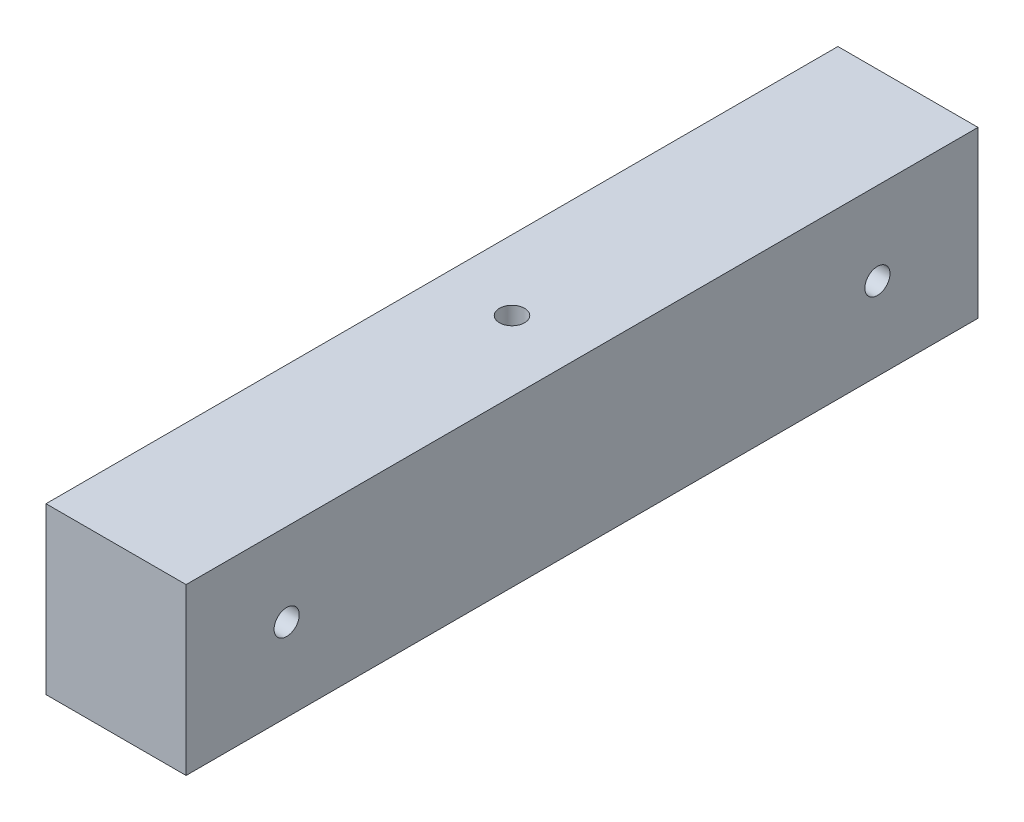
ISO-10303-21;
HEADER;
FILE_DESCRIPTION(('STEP AP214'),'2;1');
FILE_NAME('part.step','',(''),(''),'','','');
FILE_SCHEMA(('AUTOMOTIVE_DESIGN { 1 0 10303 214 1 1 1 1 }'));
ENDSEC;
DATA;
#1=APPLICATION_CONTEXT('core data for automotive mechanical design processes');
#2=APPLICATION_PROTOCOL_DEFINITION('international standard','automotive_design',2000,#1);
#3=PRODUCT_CONTEXT('',#1,'mechanical');
#4=PRODUCT('Part','Part','',(#3));
#5=PRODUCT_RELATED_PRODUCT_CATEGORY('part','',(#4));
#6=PRODUCT_DEFINITION_FORMATION('','',#4);
#7=PRODUCT_DEFINITION_CONTEXT('part definition',#1,'design');
#8=PRODUCT_DEFINITION('design','',#6,#7);
#9=PRODUCT_DEFINITION_SHAPE('','',#8);
#10=(LENGTH_UNIT() NAMED_UNIT(*) SI_UNIT(.MILLI.,.METRE.));
#11=(NAMED_UNIT(*) PLANE_ANGLE_UNIT() SI_UNIT($,.RADIAN.));
#12=(NAMED_UNIT(*) SI_UNIT($,.STERADIAN.) SOLID_ANGLE_UNIT());
#13=UNCERTAINTY_MEASURE_WITH_UNIT(LENGTH_MEASURE(1.E-05),#10,'distance_accuracy_value','');
#14=(GEOMETRIC_REPRESENTATION_CONTEXT(3) GLOBAL_UNCERTAINTY_ASSIGNED_CONTEXT((#13)) GLOBAL_UNIT_ASSIGNED_CONTEXT((#10,
#11,#12)) REPRESENTATION_CONTEXT('',''));
#15=CARTESIAN_POINT('',(0.,0.,0.));
#16=DIRECTION('',(0.,0.,1.));
#17=DIRECTION('',(1.,0.,0.));
#18=AXIS2_PLACEMENT_3D('',#15,#16,#17);
#19=CARTESIAN_POINT('',(0.,0.,100.));
#20=DIRECTION('',(1.,0.,0.));
#21=DIRECTION('',(0.,1.,0.));
#22=AXIS2_PLACEMENT_3D('',#19,#20,#21);
#23=PLANE('',#22);
#24=CARTESIAN_POINT('',(0.,10.44,87.3));
#25=DIRECTION('',(1.,0.,0.));
#26=DIRECTION('',(0.,1.,0.));
#27=AXIS2_PLACEMENT_3D('',#24,#25,#26);
#28=CIRCLE('',#27,1.5875);
#29=CARTESIAN_POINT('',(0.,12.0275,87.3));
#30=VERTEX_POINT('',#29);
#31=EDGE_CURVE('E114',#30,#30,#28,.T.);
#32=ORIENTED_EDGE('',*,*,#31,.T.);
#33=EDGE_LOOP('',(#32));
#34=FACE_BOUND('',#33,.T.);
#35=CARTESIAN_POINT('',(0.,10.44,12.7));
#36=DIRECTION('',(1.,0.,0.));
#37=DIRECTION('',(0.,1.,0.));
#38=AXIS2_PLACEMENT_3D('',#35,#36,#37);
#39=CIRCLE('',#38,1.5875);
#40=CARTESIAN_POINT('',(0.,12.0275,12.7));
#41=VERTEX_POINT('',#40);
#42=EDGE_CURVE('E117',#41,#41,#39,.T.);
#43=ORIENTED_EDGE('',*,*,#42,.T.);
#44=EDGE_LOOP('',(#43));
#45=FACE_BOUND('',#44,.T.);
#46=DIRECTION('',(0.,-1.,0.));
#47=VECTOR('',#46,1.);
#48=CARTESIAN_POINT('',(0.,0.,0.));
#49=LINE('',#48,#47);
#50=CARTESIAN_POINT('',(0.,20.88,0.));
#51=VERTEX_POINT('',#50);
#52=CARTESIAN_POINT('',(0.,0.,0.));
#53=VERTEX_POINT('',#52);
#54=EDGE_CURVE('E95',#51,#53,#49,.T.);
#55=ORIENTED_EDGE('',*,*,#54,.T.);
#56=DIRECTION('',(0.,0.,-1.));
#57=VECTOR('',#56,1.);
#58=CARTESIAN_POINT('',(0.,0.,100.));
#59=LINE('',#58,#57);
#60=CARTESIAN_POINT('',(0.,0.,100.));
#61=VERTEX_POINT('',#60);
#62=EDGE_CURVE('E11',#61,#53,#59,.T.);
#63=ORIENTED_EDGE('',*,*,#62,.F.);
#64=DIRECTION('',(0.,-1.,0.));
#65=VECTOR('',#64,1.);
#66=CARTESIAN_POINT('',(0.,0.,100.));
#67=LINE('',#66,#65);
#68=CARTESIAN_POINT('',(0.,20.88,100.));
#69=VERTEX_POINT('',#68);
#70=EDGE_CURVE('E83',#69,#61,#67,.T.);
#71=ORIENTED_EDGE('',*,*,#70,.F.);
#72=DIRECTION('',(0.,0.,-1.));
#73=VECTOR('',#72,1.);
#74=CARTESIAN_POINT('',(0.,20.88,100.));
#75=LINE('',#74,#73);
#76=EDGE_CURVE('E91',#69,#51,#75,.T.);
#77=ORIENTED_EDGE('',*,*,#76,.T.);
#78=EDGE_LOOP('',(#55,#63,#71,#77));
#79=FACE_BOUND('',#78,.T.);
#80=ADVANCED_FACE('F32',(#34,#45,#79),#23,.F.);
#81=CARTESIAN_POINT('',(0.,0.,100.));
#82=DIRECTION('',(0.,1.,0.));
#83=DIRECTION('',(0.,0.,1.));
#84=AXIS2_PLACEMENT_3D('',#81,#82,#83);
#85=PLANE('',#84);
#86=CARTESIAN_POINT('',(8.845,0.,50.));
#87=DIRECTION('',(0.,1.,0.));
#88=DIRECTION('',(0.,0.,1.));
#89=AXIS2_PLACEMENT_3D('',#86,#87,#88);
#90=CIRCLE('',#89,1.5875);
#91=CARTESIAN_POINT('',(8.845,0.,51.5875));
#92=VERTEX_POINT('',#91);
#93=EDGE_CURVE('E98',#92,#92,#90,.T.);
#94=ORIENTED_EDGE('',*,*,#93,.T.);
#95=EDGE_LOOP('',(#94));
#96=FACE_BOUND('',#95,.T.);
#97=DIRECTION('',(1.,0.,0.));
#98=VECTOR('',#97,1.);
#99=CARTESIAN_POINT('',(0.,0.,0.));
#100=LINE('',#99,#98);
#101=CARTESIAN_POINT('',(17.69,0.,0.));
#102=VERTEX_POINT('',#101);
#103=EDGE_CURVE('E87',#53,#102,#100,.T.);
#104=ORIENTED_EDGE('',*,*,#103,.T.);
#105=DIRECTION('',(0.,0.,-1.));
#106=VECTOR('',#105,1.);
#107=CARTESIAN_POINT('',(17.69,0.,100.));
#108=LINE('',#107,#106);
#109=CARTESIAN_POINT('',(17.69,0.,100.));
#110=VERTEX_POINT('',#109);
#111=EDGE_CURVE('E40',#110,#102,#108,.T.);
#112=ORIENTED_EDGE('',*,*,#111,.F.);
#113=DIRECTION('',(1.,0.,0.));
#114=VECTOR('',#113,1.);
#115=CARTESIAN_POINT('',(0.,0.,100.));
#116=LINE('',#115,#114);
#117=EDGE_CURVE('E78',#61,#110,#116,.T.);
#118=ORIENTED_EDGE('',*,*,#117,.F.);
#119=ORIENTED_EDGE('',*,*,#62,.T.);
#120=EDGE_LOOP('',(#104,#112,#118,#119));
#121=FACE_BOUND('',#120,.T.);
#122=ADVANCED_FACE('F86',(#96,#121),#85,.F.);
#123=CARTESIAN_POINT('',(17.69,0.,100.));
#124=DIRECTION('',(-1.,0.,0.));
#125=DIRECTION('',(0.,-1.,0.));
#126=AXIS2_PLACEMENT_3D('',#123,#124,#125);
#127=PLANE('',#126);
#128=CARTESIAN_POINT('',(17.69,10.44,87.3));
#129=DIRECTION('',(1.,0.,0.));
#130=DIRECTION('',(0.,1.,0.));
#131=AXIS2_PLACEMENT_3D('',#128,#129,#130);
#132=CIRCLE('',#131,1.5875);
#133=CARTESIAN_POINT('',(17.69,12.0275,87.3));
#134=VERTEX_POINT('',#133);
#135=EDGE_CURVE('E120',#134,#134,#132,.T.);
#136=ORIENTED_EDGE('',*,*,#135,.F.);
#137=EDGE_LOOP('',(#136));
#138=FACE_BOUND('',#137,.T.);
#139=CARTESIAN_POINT('',(17.69,10.44,12.7));
#140=DIRECTION('',(1.,0.,0.));
#141=DIRECTION('',(0.,1.,0.));
#142=AXIS2_PLACEMENT_3D('',#139,#140,#141);
#143=CIRCLE('',#142,1.5875);
#144=CARTESIAN_POINT('',(17.69,12.0275,12.7));
#145=VERTEX_POINT('',#144);
#146=EDGE_CURVE('E121',#145,#145,#143,.T.);
#147=ORIENTED_EDGE('',*,*,#146,.F.);
#148=EDGE_LOOP('',(#147));
#149=FACE_BOUND('',#148,.T.);
#150=DIRECTION('',(0.,1.,0.));
#151=VECTOR('',#150,1.);
#152=CARTESIAN_POINT('',(17.69,0.,0.));
#153=LINE('',#152,#151);
#154=CARTESIAN_POINT('',(17.69,20.88,0.));
#155=VERTEX_POINT('',#154);
#156=EDGE_CURVE('E65',#102,#155,#153,.T.);
#157=ORIENTED_EDGE('',*,*,#156,.T.);
#158=DIRECTION('',(0.,0.,-1.));
#159=VECTOR('',#158,1.);
#160=CARTESIAN_POINT('',(17.69,20.88,100.));
#161=LINE('',#160,#159);
#162=CARTESIAN_POINT('',(17.69,20.88,100.));
#163=VERTEX_POINT('',#162);
#164=EDGE_CURVE('E88',#163,#155,#161,.T.);
#165=ORIENTED_EDGE('',*,*,#164,.F.);
#166=DIRECTION('',(0.,1.,0.));
#167=VECTOR('',#166,1.);
#168=CARTESIAN_POINT('',(17.69,0.,100.));
#169=LINE('',#168,#167);
#170=EDGE_CURVE('E81',#110,#163,#169,.T.);
#171=ORIENTED_EDGE('',*,*,#170,.F.);
#172=ORIENTED_EDGE('',*,*,#111,.T.);
#173=EDGE_LOOP('',(#157,#165,#171,#172));
#174=FACE_BOUND('',#173,.T.);
#175=ADVANCED_FACE('F89',(#138,#149,#174),#127,.F.);
#176=CARTESIAN_POINT('',(0.,20.88,100.));
#177=DIRECTION('',(0.,-1.,0.));
#178=DIRECTION('',(0.,0.,-1.));
#179=AXIS2_PLACEMENT_3D('',#176,#177,#178);
#180=PLANE('',#179);
#181=CARTESIAN_POINT('',(8.845,20.88,50.));
#182=DIRECTION('',(0.,1.,0.));
#183=DIRECTION('',(0.,0.,1.));
#184=AXIS2_PLACEMENT_3D('',#181,#182,#183);
#185=CIRCLE('',#184,1.5875);
#186=CARTESIAN_POINT('',(8.845,20.88,51.5875));
#187=VERTEX_POINT('',#186);
#188=EDGE_CURVE('E111',#187,#187,#185,.T.);
#189=ORIENTED_EDGE('',*,*,#188,.F.);
#190=EDGE_LOOP('',(#189));
#191=FACE_BOUND('',#190,.T.);
#192=DIRECTION('',(-1.,0.,0.));
#193=VECTOR('',#192,1.);
#194=CARTESIAN_POINT('',(0.,20.88,0.));
#195=LINE('',#194,#193);
#196=EDGE_CURVE('E71',#155,#51,#195,.T.);
#197=ORIENTED_EDGE('',*,*,#196,.T.);
#198=ORIENTED_EDGE('',*,*,#76,.F.);
#199=DIRECTION('',(-1.,0.,0.));
#200=VECTOR('',#199,1.);
#201=CARTESIAN_POINT('',(0.,20.88,100.));
#202=LINE('',#201,#200);
#203=EDGE_CURVE('E48',#163,#69,#202,.T.);
#204=ORIENTED_EDGE('',*,*,#203,.F.);
#205=ORIENTED_EDGE('',*,*,#164,.T.);
#206=EDGE_LOOP('',(#197,#198,#204,#205));
#207=FACE_BOUND('',#206,.T.);
#208=ADVANCED_FACE('F103',(#191,#207),#180,.F.);
#209=CARTESIAN_POINT('',(0.,0.,100.));
#210=DIRECTION('',(0.,0.,-1.));
#211=DIRECTION('',(-1.,0.,0.));
#212=AXIS2_PLACEMENT_3D('',#209,#210,#211);
#213=PLANE('',#212);
#214=ORIENTED_EDGE('',*,*,#70,.T.);
#215=ORIENTED_EDGE('',*,*,#117,.T.);
#216=ORIENTED_EDGE('',*,*,#170,.T.);
#217=ORIENTED_EDGE('',*,*,#203,.T.);
#218=EDGE_LOOP('',(#214,#215,#216,#217));
#219=FACE_BOUND('',#218,.T.);
#220=ADVANCED_FACE('F79',(#219),#213,.F.);
#221=CARTESIAN_POINT('',(0.,0.,0.));
#222=DIRECTION('',(0.,0.,-1.));
#223=DIRECTION('',(-1.,0.,0.));
#224=AXIS2_PLACEMENT_3D('',#221,#222,#223);
#225=PLANE('',#224);
#226=ORIENTED_EDGE('',*,*,#54,.F.);
#227=ORIENTED_EDGE('',*,*,#196,.F.);
#228=ORIENTED_EDGE('',*,*,#156,.F.);
#229=ORIENTED_EDGE('',*,*,#103,.F.);
#230=EDGE_LOOP('',(#226,#227,#228,#229));
#231=FACE_BOUND('',#230,.T.);
#232=ADVANCED_FACE('F106',(#231),#225,.T.);
#233=CARTESIAN_POINT('',(8.845,-85.9,50.));
#234=DIRECTION('',(0.,1.,0.));
#235=DIRECTION('',(0.,0.,1.));
#236=AXIS2_PLACEMENT_3D('',#233,#234,#235);
#237=CYLINDRICAL_SURFACE('',#236,1.5875);
#238=ORIENTED_EDGE('',*,*,#188,.T.);
#239=EDGE_LOOP('',(#238));
#240=FACE_BOUND('',#239,.T.);
#241=ORIENTED_EDGE('',*,*,#93,.F.);
#242=EDGE_LOOP('',(#241));
#243=FACE_BOUND('',#242,.T.);
#244=ADVANCED_FACE('F138',(#240,#243),#237,.F.);
#245=CARTESIAN_POINT('',(-82.31,10.44,12.7));
#246=DIRECTION('',(1.,0.,0.));
#247=DIRECTION('',(0.,1.,0.));
#248=AXIS2_PLACEMENT_3D('',#245,#246,#247);
#249=CYLINDRICAL_SURFACE('',#248,1.5875);
#250=ORIENTED_EDGE('',*,*,#146,.T.);
#251=EDGE_LOOP('',(#250));
#252=FACE_BOUND('',#251,.T.);
#253=ORIENTED_EDGE('',*,*,#42,.F.);
#254=EDGE_LOOP('',(#253));
#255=FACE_BOUND('',#254,.T.);
#256=ADVANCED_FACE('F135',(#252,#255),#249,.F.);
#257=CARTESIAN_POINT('',(-82.31,10.44,87.3));
#258=DIRECTION('',(1.,0.,0.));
#259=DIRECTION('',(0.,1.,0.));
#260=AXIS2_PLACEMENT_3D('',#257,#258,#259);
#261=CYLINDRICAL_SURFACE('',#260,1.5875);
#262=ORIENTED_EDGE('',*,*,#135,.T.);
#263=EDGE_LOOP('',(#262));
#264=FACE_BOUND('',#263,.T.);
#265=ORIENTED_EDGE('',*,*,#31,.F.);
#266=EDGE_LOOP('',(#265));
#267=FACE_BOUND('',#266,.T.);
#268=ADVANCED_FACE('F127',(#264,#267),#261,.F.);
#269=CLOSED_SHELL('',(#80,#122,#175,#208,#220,#232,#244,#256,#268));
#270=MANIFOLD_SOLID_BREP('B2',#269);
#271=ADVANCED_BREP_SHAPE_REPRESENTATION('',(#18,#270),#14);
#272=SHAPE_DEFINITION_REPRESENTATION(#9,#271);
ENDSEC;
END-ISO-10303-21;
